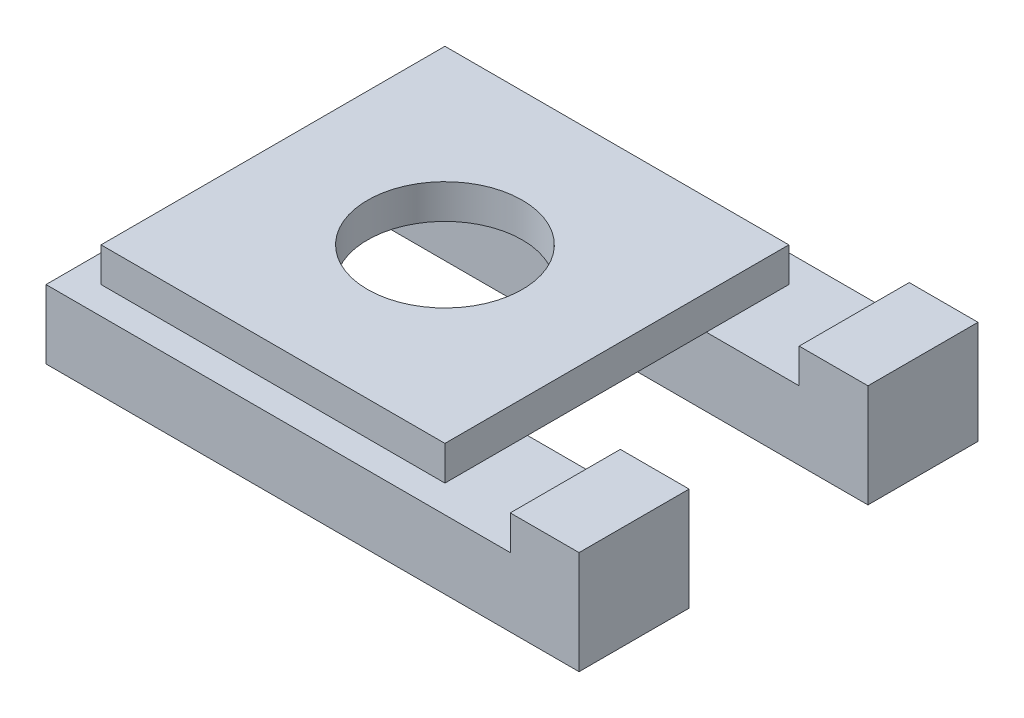
ISO-10303-21;
HEADER;
FILE_DESCRIPTION(('STEP AP214'),'2;1');
FILE_NAME('part.step','',(''),(''),'','','');
FILE_SCHEMA(('AUTOMOTIVE_DESIGN { 1 0 10303 214 1 1 1 1 }'));
ENDSEC;
DATA;
#1=APPLICATION_CONTEXT('core data for automotive mechanical design processes');
#2=APPLICATION_PROTOCOL_DEFINITION('international standard','automotive_design',2000,#1);
#3=PRODUCT_CONTEXT('',#1,'mechanical');
#4=PRODUCT('Part','Part','',(#3));
#5=PRODUCT_RELATED_PRODUCT_CATEGORY('part','',(#4));
#6=PRODUCT_DEFINITION_FORMATION('','',#4);
#7=PRODUCT_DEFINITION_CONTEXT('part definition',#1,'design');
#8=PRODUCT_DEFINITION('design','',#6,#7);
#9=PRODUCT_DEFINITION_SHAPE('','',#8);
#10=(LENGTH_UNIT() NAMED_UNIT(*) SI_UNIT(.MILLI.,.METRE.));
#11=(NAMED_UNIT(*) PLANE_ANGLE_UNIT() SI_UNIT($,.RADIAN.));
#12=(NAMED_UNIT(*) SI_UNIT($,.STERADIAN.) SOLID_ANGLE_UNIT());
#13=UNCERTAINTY_MEASURE_WITH_UNIT(LENGTH_MEASURE(1.E-05),#10,'distance_accuracy_value','');
#14=(GEOMETRIC_REPRESENTATION_CONTEXT(3) GLOBAL_UNCERTAINTY_ASSIGNED_CONTEXT((#13)) GLOBAL_UNIT_ASSIGNED_CONTEXT((#10,
#11,#12)) REPRESENTATION_CONTEXT('',''));
#15=CARTESIAN_POINT('',(0.,0.,0.));
#16=DIRECTION('',(0.,0.,1.));
#17=DIRECTION('',(1.,0.,0.));
#18=AXIS2_PLACEMENT_3D('',#15,#16,#17);
#19=CARTESIAN_POINT('',(0.,0.,0.));
#20=DIRECTION('',(0.,1.,0.));
#21=DIRECTION('',(0.,0.,1.));
#22=AXIS2_PLACEMENT_3D('',#19,#20,#21);
#23=PLANE('',#22);
#24=CARTESIAN_POINT('',(0.,0.,0.));
#25=DIRECTION('',(0.,1.,0.));
#26=DIRECTION('',(0.,0.,1.));
#27=AXIS2_PLACEMENT_3D('',#24,#25,#26);
#28=CIRCLE('',#27,22.5);
#29=CARTESIAN_POINT('',(0.,0.,22.5));
#30=VERTEX_POINT('',#29);
#31=EDGE_CURVE('E311',#30,#30,#28,.T.);
#32=ORIENTED_EDGE('',*,*,#31,.T.);
#33=EDGE_LOOP('',(#32));
#34=FACE_BOUND('',#33,.T.);
#35=DIRECTION('',(-1.,0.,0.));
#36=VECTOR('',#35,1.);
#37=CARTESIAN_POINT('',(77.,0.,-26.));
#38=LINE('',#37,#36);
#39=CARTESIAN_POINT('',(50.,0.,-26.));
#40=VERTEX_POINT('',#39);
#41=CARTESIAN_POINT('',(-50.,0.,-26.));
#42=VERTEX_POINT('',#41);
#43=EDGE_CURVE('E215',#40,#42,#38,.T.);
#44=ORIENTED_EDGE('',*,*,#43,.F.);
#45=DIRECTION('',(0.,0.,-1.));
#46=VECTOR('',#45,1.);
#47=CARTESIAN_POINT('',(50.,0.,50.));
#48=LINE('',#47,#46);
#49=CARTESIAN_POINT('',(50.,0.,26.));
#50=VERTEX_POINT('',#49);
#51=EDGE_CURVE('E130',#50,#40,#48,.T.);
#52=ORIENTED_EDGE('',*,*,#51,.F.);
#53=DIRECTION('',(-1.,0.,0.));
#54=VECTOR('',#53,1.);
#55=CARTESIAN_POINT('',(77.,0.,26.));
#56=LINE('',#55,#54);
#57=CARTESIAN_POINT('',(-50.,0.,26.));
#58=VERTEX_POINT('',#57);
#59=EDGE_CURVE('E191',#50,#58,#56,.T.);
#60=ORIENTED_EDGE('',*,*,#59,.T.);
#61=DIRECTION('',(0.,0.,1.));
#62=VECTOR('',#61,1.);
#63=CARTESIAN_POINT('',(-50.,0.,50.));
#64=LINE('',#63,#62);
#65=EDGE_CURVE('E125',#42,#58,#64,.T.);
#66=ORIENTED_EDGE('',*,*,#65,.F.);
#67=EDGE_LOOP('',(#44,#52,#60,#66));
#68=FACE_BOUND('',#67,.T.);
#69=ADVANCED_FACE('F44',(#34,#68),#23,.F.);
#70=CARTESIAN_POINT('',(0.,10.,0.));
#71=DIRECTION('',(0.,1.,0.));
#72=DIRECTION('',(0.,0.,1.));
#73=AXIS2_PLACEMENT_3D('',#70,#71,#72);
#74=PLANE('',#73);
#75=DIRECTION('',(0.,0.,1.));
#76=VECTOR('',#75,1.);
#77=CARTESIAN_POINT('',(-50.,10.,50.));
#78=LINE('',#77,#76);
#79=CARTESIAN_POINT('',(-50.,10.,-50.));
#80=VERTEX_POINT('',#79);
#81=CARTESIAN_POINT('',(-50.,10.,50.));
#82=VERTEX_POINT('',#81);
#83=EDGE_CURVE('E97',#80,#82,#78,.T.);
#84=ORIENTED_EDGE('',*,*,#83,.T.);
#85=DIRECTION('',(1.,0.,0.));
#86=VECTOR('',#85,1.);
#87=CARTESIAN_POINT('',(50.,10.,50.));
#88=LINE('',#87,#86);
#89=CARTESIAN_POINT('',(50.,10.,50.));
#90=VERTEX_POINT('',#89);
#91=EDGE_CURVE('E93',#82,#90,#88,.T.);
#92=ORIENTED_EDGE('',*,*,#91,.T.);
#93=DIRECTION('',(0.,0.,-1.));
#94=VECTOR('',#93,1.);
#95=CARTESIAN_POINT('',(50.,10.,50.));
#96=LINE('',#95,#94);
#97=CARTESIAN_POINT('',(50.,10.,-50.));
#98=VERTEX_POINT('',#97);
#99=EDGE_CURVE('E96',#90,#98,#96,.T.);
#100=ORIENTED_EDGE('',*,*,#99,.T.);
#101=DIRECTION('',(-1.,0.,0.));
#102=VECTOR('',#101,1.);
#103=CARTESIAN_POINT('',(50.,10.,-50.));
#104=LINE('',#103,#102);
#105=EDGE_CURVE('E62',#98,#80,#104,.T.);
#106=ORIENTED_EDGE('',*,*,#105,.T.);
#107=EDGE_LOOP('',(#84,#92,#100,#106));
#108=FACE_BOUND('',#107,.T.);
#109=CARTESIAN_POINT('',(0.,10.,0.));
#110=DIRECTION('',(0.,1.,0.));
#111=DIRECTION('',(0.,0.,1.));
#112=AXIS2_PLACEMENT_3D('',#109,#110,#111);
#113=CIRCLE('',#112,22.5);
#114=CARTESIAN_POINT('',(0.,10.,22.5));
#115=VERTEX_POINT('',#114);
#116=EDGE_CURVE('E310',#115,#115,#113,.T.);
#117=ORIENTED_EDGE('',*,*,#116,.F.);
#118=EDGE_LOOP('',(#117));
#119=FACE_BOUND('',#118,.T.);
#120=ADVANCED_FACE('F91',(#108,#119),#74,.T.);
#121=CARTESIAN_POINT('',(-50.,10.,50.));
#122=DIRECTION('',(1.,0.,0.));
#123=DIRECTION('',(0.,0.,-1.));
#124=AXIS2_PLACEMENT_3D('',#121,#122,#123);
#125=PLANE('',#124);
#126=CARTESIAN_POINT('',(-50.,0.,-50.));
#127=VERTEX_POINT('',#126);
#128=EDGE_CURVE('E118',#127,#42,#64,.T.);
#129=ORIENTED_EDGE('',*,*,#128,.T.);
#130=ORIENTED_EDGE('',*,*,#65,.T.);
#131=CARTESIAN_POINT('',(-50.,0.,50.));
#132=VERTEX_POINT('',#131);
#133=EDGE_CURVE('E123',#58,#132,#64,.T.);
#134=ORIENTED_EDGE('',*,*,#133,.T.);
#135=DIRECTION('',(0.,-1.,0.));
#136=VECTOR('',#135,1.);
#137=CARTESIAN_POINT('',(-50.,10.,50.));
#138=LINE('',#137,#136);
#139=EDGE_CURVE('E11',#82,#132,#138,.T.);
#140=ORIENTED_EDGE('',*,*,#139,.F.);
#141=ORIENTED_EDGE('',*,*,#83,.F.);
#142=DIRECTION('',(0.,-1.,0.));
#143=VECTOR('',#142,1.);
#144=CARTESIAN_POINT('',(-50.,10.,-50.));
#145=LINE('',#144,#143);
#146=EDGE_CURVE('E113',#80,#127,#145,.T.);
#147=ORIENTED_EDGE('',*,*,#146,.T.);
#148=EDGE_LOOP('',(#129,#130,#134,#140,#141,#147));
#149=FACE_BOUND('',#148,.T.);
#150=ADVANCED_FACE('F50',(#149),#125,.F.);
#151=CARTESIAN_POINT('',(50.,10.,50.));
#152=DIRECTION('',(0.,0.,-1.));
#153=DIRECTION('',(-1.,0.,0.));
#154=AXIS2_PLACEMENT_3D('',#151,#152,#153);
#155=PLANE('',#154);
#156=DIRECTION('',(1.,0.,0.));
#157=VECTOR('',#156,1.);
#158=CARTESIAN_POINT('',(50.,0.,50.));
#159=LINE('',#158,#157);
#160=CARTESIAN_POINT('',(50.,0.,50.));
#161=VERTEX_POINT('',#160);
#162=EDGE_CURVE('E81',#132,#161,#159,.T.);
#163=ORIENTED_EDGE('',*,*,#162,.T.);
#164=DIRECTION('',(0.,-1.,0.));
#165=VECTOR('',#164,1.);
#166=CARTESIAN_POINT('',(50.,10.,50.));
#167=LINE('',#166,#165);
#168=EDGE_CURVE('E54',#90,#161,#167,.T.);
#169=ORIENTED_EDGE('',*,*,#168,.F.);
#170=ORIENTED_EDGE('',*,*,#91,.F.);
#171=ORIENTED_EDGE('',*,*,#139,.T.);
#172=EDGE_LOOP('',(#163,#169,#170,#171));
#173=FACE_BOUND('',#172,.T.);
#174=ADVANCED_FACE('F104',(#173),#155,.F.);
#175=CARTESIAN_POINT('',(50.,10.,50.));
#176=DIRECTION('',(-1.,0.,0.));
#177=DIRECTION('',(0.,0.,1.));
#178=AXIS2_PLACEMENT_3D('',#175,#176,#177);
#179=PLANE('',#178);
#180=EDGE_CURVE('E73',#161,#50,#48,.T.);
#181=ORIENTED_EDGE('',*,*,#180,.T.);
#182=ORIENTED_EDGE('',*,*,#51,.T.);
#183=CARTESIAN_POINT('',(50.,0.,-50.));
#184=VERTEX_POINT('',#183);
#185=EDGE_CURVE('E131',#40,#184,#48,.T.);
#186=ORIENTED_EDGE('',*,*,#185,.T.);
#187=DIRECTION('',(0.,-1.,0.));
#188=VECTOR('',#187,1.);
#189=CARTESIAN_POINT('',(50.,10.,-50.));
#190=LINE('',#189,#188);
#191=EDGE_CURVE('E107',#98,#184,#190,.T.);
#192=ORIENTED_EDGE('',*,*,#191,.F.);
#193=ORIENTED_EDGE('',*,*,#99,.F.);
#194=ORIENTED_EDGE('',*,*,#168,.T.);
#195=EDGE_LOOP('',(#181,#182,#186,#192,#193,#194));
#196=FACE_BOUND('',#195,.T.);
#197=ADVANCED_FACE('F108',(#196),#179,.F.);
#198=CARTESIAN_POINT('',(50.,10.,-50.));
#199=DIRECTION('',(0.,0.,1.));
#200=DIRECTION('',(1.,0.,0.));
#201=AXIS2_PLACEMENT_3D('',#198,#199,#200);
#202=PLANE('',#201);
#203=DIRECTION('',(-1.,0.,0.));
#204=VECTOR('',#203,1.);
#205=CARTESIAN_POINT('',(50.,0.,-50.));
#206=LINE('',#205,#204);
#207=EDGE_CURVE('E128',#184,#127,#206,.T.);
#208=ORIENTED_EDGE('',*,*,#207,.T.);
#209=ORIENTED_EDGE('',*,*,#146,.F.);
#210=ORIENTED_EDGE('',*,*,#105,.F.);
#211=ORIENTED_EDGE('',*,*,#191,.T.);
#212=EDGE_LOOP('',(#208,#209,#210,#211));
#213=FACE_BOUND('',#212,.T.);
#214=ADVANCED_FACE('F143',(#213),#202,.F.);
#215=CARTESIAN_POINT('',(0.,10.,0.));
#216=DIRECTION('',(0.,-1.,0.));
#217=DIRECTION('',(0.,0.,-1.));
#218=AXIS2_PLACEMENT_3D('',#215,#216,#217);
#219=CYLINDRICAL_SURFACE('',#218,22.5);
#220=ORIENTED_EDGE('',*,*,#116,.T.);
#221=EDGE_LOOP('',(#220));
#222=FACE_BOUND('',#221,.T.);
#223=ORIENTED_EDGE('',*,*,#31,.F.);
#224=EDGE_LOOP('',(#223));
#225=FACE_BOUND('',#224,.T.);
#226=ADVANCED_FACE('F365',(#222,#225),#219,.F.);
#227=CARTESIAN_POINT('',(77.,0.,26.));
#228=DIRECTION('',(0.,1.,0.));
#229=DIRECTION('',(-1.,0.,0.));
#230=AXIS2_PLACEMENT_3D('',#227,#228,#229);
#231=PLANE('',#230);
#232=ORIENTED_EDGE('',*,*,#133,.F.);
#233=CARTESIAN_POINT('',(-58.,0.,26.));
#234=VERTEX_POINT('',#233);
#235=EDGE_CURVE('E196',#58,#234,#56,.T.);
#236=ORIENTED_EDGE('',*,*,#235,.T.);
#237=DIRECTION('',(0.,0.,1.));
#238=VECTOR('',#237,1.);
#239=CARTESIAN_POINT('',(-58.,0.,26.));
#240=LINE('',#239,#238);
#241=CARTESIAN_POINT('',(-58.,0.,58.));
#242=VERTEX_POINT('',#241);
#243=EDGE_CURVE('E275',#234,#242,#240,.T.);
#244=ORIENTED_EDGE('',*,*,#243,.T.);
#245=DIRECTION('',(-1.,0.,0.));
#246=VECTOR('',#245,1.);
#247=CARTESIAN_POINT('',(77.,0.,58.));
#248=LINE('',#247,#246);
#249=CARTESIAN_POINT('',(77.,0.,58.));
#250=VERTEX_POINT('',#249);
#251=EDGE_CURVE('E214',#250,#242,#248,.T.);
#252=ORIENTED_EDGE('',*,*,#251,.F.);
#253=DIRECTION('',(0.,0.,1.));
#254=VECTOR('',#253,1.);
#255=CARTESIAN_POINT('',(77.,0.,26.));
#256=LINE('',#255,#254);
#257=CARTESIAN_POINT('',(77.,0.,26.));
#258=VERTEX_POINT('',#257);
#259=EDGE_CURVE('E206',#258,#250,#256,.T.);
#260=ORIENTED_EDGE('',*,*,#259,.F.);
#261=EDGE_CURVE('E192',#258,#50,#56,.T.);
#262=ORIENTED_EDGE('',*,*,#261,.T.);
#263=ORIENTED_EDGE('',*,*,#180,.F.);
#264=ORIENTED_EDGE('',*,*,#162,.F.);
#265=EDGE_LOOP('',(#232,#236,#244,#252,#260,#262,#263,#264));
#266=FACE_BOUND('',#265,.T.);
#267=ADVANCED_FACE('F204',(#266),#231,.T.);
#268=CARTESIAN_POINT('',(77.,10.,26.));
#269=DIRECTION('',(-1.,0.,0.));
#270=DIRECTION('',(0.,0.,1.));
#271=AXIS2_PLACEMENT_3D('',#268,#269,#270);
#272=PLANE('',#271);
#273=DIRECTION('',(0.,-1.,0.));
#274=VECTOR('',#273,1.);
#275=CARTESIAN_POINT('',(77.,10.,58.));
#276=LINE('',#275,#274);
#277=CARTESIAN_POINT('',(77.,10.,58.));
#278=VERTEX_POINT('',#277);
#279=EDGE_CURVE('E288',#278,#250,#276,.T.);
#280=ORIENTED_EDGE('',*,*,#279,.F.);
#281=DIRECTION('',(0.,0.,1.));
#282=VECTOR('',#281,1.);
#283=CARTESIAN_POINT('',(77.,10.,26.));
#284=LINE('',#283,#282);
#285=CARTESIAN_POINT('',(77.,10.,26.));
#286=VERTEX_POINT('',#285);
#287=EDGE_CURVE('E293',#286,#278,#284,.T.);
#288=ORIENTED_EDGE('',*,*,#287,.F.);
#289=DIRECTION('',(0.,-1.,0.));
#290=VECTOR('',#289,1.);
#291=CARTESIAN_POINT('',(77.,10.,26.));
#292=LINE('',#291,#290);
#293=EDGE_CURVE('E269',#286,#258,#292,.T.);
#294=ORIENTED_EDGE('',*,*,#293,.T.);
#295=ORIENTED_EDGE('',*,*,#259,.T.);
#296=EDGE_LOOP('',(#280,#288,#294,#295));
#297=FACE_BOUND('',#296,.T.);
#298=ADVANCED_FACE('F338',(#297),#272,.T.);
#299=CARTESIAN_POINT('',(97.,10.,26.));
#300=DIRECTION('',(0.,1.,0.));
#301=DIRECTION('',(0.,0.,1.));
#302=AXIS2_PLACEMENT_3D('',#299,#300,#301);
#303=PLANE('',#302);
#304=DIRECTION('',(-1.,0.,0.));
#305=VECTOR('',#304,1.);
#306=CARTESIAN_POINT('',(97.,10.,58.));
#307=LINE('',#306,#305);
#308=CARTESIAN_POINT('',(97.,10.,58.));
#309=VERTEX_POINT('',#308);
#310=EDGE_CURVE('E284',#309,#278,#307,.T.);
#311=ORIENTED_EDGE('',*,*,#310,.F.);
#312=DIRECTION('',(0.,0.,1.));
#313=VECTOR('',#312,1.);
#314=CARTESIAN_POINT('',(97.,10.,26.));
#315=LINE('',#314,#313);
#316=CARTESIAN_POINT('',(97.,10.,26.));
#317=VERTEX_POINT('',#316);
#318=EDGE_CURVE('E297',#317,#309,#315,.T.);
#319=ORIENTED_EDGE('',*,*,#318,.F.);
#320=DIRECTION('',(-1.,0.,0.));
#321=VECTOR('',#320,1.);
#322=CARTESIAN_POINT('',(97.,10.,26.));
#323=LINE('',#322,#321);
#324=EDGE_CURVE('E266',#317,#286,#323,.T.);
#325=ORIENTED_EDGE('',*,*,#324,.T.);
#326=ORIENTED_EDGE('',*,*,#287,.T.);
#327=EDGE_LOOP('',(#311,#319,#325,#326));
#328=FACE_BOUND('',#327,.T.);
#329=ADVANCED_FACE('F345',(#328),#303,.T.);
#330=CARTESIAN_POINT('',(97.,-20.,26.));
#331=DIRECTION('',(1.,0.,0.));
#332=DIRECTION('',(0.,0.,-1.));
#333=AXIS2_PLACEMENT_3D('',#330,#331,#332);
#334=PLANE('',#333);
#335=DIRECTION('',(0.,1.,0.));
#336=VECTOR('',#335,1.);
#337=CARTESIAN_POINT('',(97.,-20.,58.));
#338=LINE('',#337,#336);
#339=CARTESIAN_POINT('',(97.,-20.,58.));
#340=VERTEX_POINT('',#339);
#341=EDGE_CURVE('E281',#340,#309,#338,.T.);
#342=ORIENTED_EDGE('',*,*,#341,.F.);
#343=DIRECTION('',(0.,0.,1.));
#344=VECTOR('',#343,1.);
#345=CARTESIAN_POINT('',(97.,-20.,26.));
#346=LINE('',#345,#344);
#347=CARTESIAN_POINT('',(97.,-20.,26.));
#348=VERTEX_POINT('',#347);
#349=EDGE_CURVE('E304',#348,#340,#346,.T.);
#350=ORIENTED_EDGE('',*,*,#349,.F.);
#351=DIRECTION('',(0.,1.,0.));
#352=VECTOR('',#351,1.);
#353=CARTESIAN_POINT('',(97.,-20.,26.));
#354=LINE('',#353,#352);
#355=EDGE_CURVE('E265',#348,#317,#354,.T.);
#356=ORIENTED_EDGE('',*,*,#355,.T.);
#357=ORIENTED_EDGE('',*,*,#318,.T.);
#358=EDGE_LOOP('',(#342,#350,#356,#357));
#359=FACE_BOUND('',#358,.T.);
#360=ADVANCED_FACE('F341',(#359),#334,.T.);
#361=CARTESIAN_POINT('',(-58.,-20.,26.));
#362=DIRECTION('',(0.,-1.,0.));
#363=DIRECTION('',(0.,0.,-1.));
#364=AXIS2_PLACEMENT_3D('',#361,#362,#363);
#365=PLANE('',#364);
#366=DIRECTION('',(1.,0.,0.));
#367=VECTOR('',#366,1.);
#368=CARTESIAN_POINT('',(-58.,-20.,58.));
#369=LINE('',#368,#367);
#370=CARTESIAN_POINT('',(-58.,-20.,58.));
#371=VERTEX_POINT('',#370);
#372=EDGE_CURVE('E280',#371,#340,#369,.T.);
#373=ORIENTED_EDGE('',*,*,#372,.F.);
#374=DIRECTION('',(0.,0.,1.));
#375=VECTOR('',#374,1.);
#376=CARTESIAN_POINT('',(-58.,-20.,26.));
#377=LINE('',#376,#375);
#378=CARTESIAN_POINT('',(-58.,-20.,26.));
#379=VERTEX_POINT('',#378);
#380=EDGE_CURVE('E303',#379,#371,#377,.T.);
#381=ORIENTED_EDGE('',*,*,#380,.F.);
#382=DIRECTION('',(1.,0.,0.));
#383=VECTOR('',#382,1.);
#384=CARTESIAN_POINT('',(-58.,-20.,26.));
#385=LINE('',#384,#383);
#386=EDGE_CURVE('E256',#379,#348,#385,.T.);
#387=ORIENTED_EDGE('',*,*,#386,.T.);
#388=ORIENTED_EDGE('',*,*,#349,.T.);
#389=EDGE_LOOP('',(#373,#381,#387,#388));
#390=FACE_BOUND('',#389,.T.);
#391=ADVANCED_FACE('F335',(#390),#365,.T.);
#392=CARTESIAN_POINT('',(-58.,0.,26.));
#393=DIRECTION('',(-1.,0.,0.));
#394=DIRECTION('',(0.,0.,1.));
#395=AXIS2_PLACEMENT_3D('',#392,#393,#394);
#396=PLANE('',#395);
#397=DIRECTION('',(0.,-1.,0.));
#398=VECTOR('',#397,1.);
#399=CARTESIAN_POINT('',(-58.,0.,58.));
#400=LINE('',#399,#398);
#401=EDGE_CURVE('E219',#242,#371,#400,.T.);
#402=ORIENTED_EDGE('',*,*,#401,.F.);
#403=ORIENTED_EDGE('',*,*,#243,.F.);
#404=DIRECTION('',(0.,-1.,0.));
#405=VECTOR('',#404,1.);
#406=CARTESIAN_POINT('',(-58.,0.,26.));
#407=LINE('',#406,#405);
#408=EDGE_CURVE('E208',#234,#379,#407,.T.);
#409=ORIENTED_EDGE('',*,*,#408,.T.);
#410=ORIENTED_EDGE('',*,*,#380,.T.);
#411=EDGE_LOOP('',(#402,#403,#409,#410));
#412=FACE_BOUND('',#411,.T.);
#413=ADVANCED_FACE('F326',(#412),#396,.T.);
#414=CARTESIAN_POINT('',(0.,0.,26.));
#415=DIRECTION('',(0.,0.,1.));
#416=DIRECTION('',(1.,0.,0.));
#417=AXIS2_PLACEMENT_3D('',#414,#415,#416);
#418=PLANE('',#417);
#419=ORIENTED_EDGE('',*,*,#261,.F.);
#420=ORIENTED_EDGE('',*,*,#293,.F.);
#421=ORIENTED_EDGE('',*,*,#324,.F.);
#422=ORIENTED_EDGE('',*,*,#355,.F.);
#423=ORIENTED_EDGE('',*,*,#386,.F.);
#424=ORIENTED_EDGE('',*,*,#408,.F.);
#425=ORIENTED_EDGE('',*,*,#235,.F.);
#426=ORIENTED_EDGE('',*,*,#59,.F.);
#427=EDGE_LOOP('',(#419,#420,#421,#422,#423,#424,#425,#426));
#428=FACE_BOUND('',#427,.T.);
#429=ADVANCED_FACE('F195',(#428),#418,.F.);
#430=CARTESIAN_POINT('',(0.,0.,58.));
#431=DIRECTION('',(0.,0.,1.));
#432=DIRECTION('',(1.,0.,0.));
#433=AXIS2_PLACEMENT_3D('',#430,#431,#432);
#434=PLANE('',#433);
#435=ORIENTED_EDGE('',*,*,#251,.T.);
#436=ORIENTED_EDGE('',*,*,#401,.T.);
#437=ORIENTED_EDGE('',*,*,#372,.T.);
#438=ORIENTED_EDGE('',*,*,#341,.T.);
#439=ORIENTED_EDGE('',*,*,#310,.T.);
#440=ORIENTED_EDGE('',*,*,#279,.T.);
#441=EDGE_LOOP('',(#435,#436,#437,#438,#439,#440));
#442=FACE_BOUND('',#441,.T.);
#443=ADVANCED_FACE('F333',(#442),#434,.T.);
#444=CARTESIAN_POINT('',(77.,0.,-26.));
#445=DIRECTION('',(0.,-1.,0.));
#446=DIRECTION('',(1.,0.,0.));
#447=AXIS2_PLACEMENT_3D('',#444,#445,#446);
#448=PLANE('',#447);
#449=ORIENTED_EDGE('',*,*,#185,.F.);
#450=CARTESIAN_POINT('',(77.,0.,-26.));
#451=VERTEX_POINT('',#450);
#452=EDGE_CURVE('E583',#451,#40,#38,.T.);
#453=ORIENTED_EDGE('',*,*,#452,.F.);
#454=DIRECTION('',(0.,0.,-1.));
#455=VECTOR('',#454,1.);
#456=CARTESIAN_POINT('',(77.,0.,-26.));
#457=LINE('',#456,#455);
#458=CARTESIAN_POINT('',(77.,0.,-58.));
#459=VERTEX_POINT('',#458);
#460=EDGE_CURVE('E247',#451,#459,#457,.T.);
#461=ORIENTED_EDGE('',*,*,#460,.T.);
#462=DIRECTION('',(-1.,0.,0.));
#463=VECTOR('',#462,1.);
#464=CARTESIAN_POINT('',(77.,0.,-58.));
#465=LINE('',#464,#463);
#466=CARTESIAN_POINT('',(-58.,0.,-58.));
#467=VERTEX_POINT('',#466);
#468=EDGE_CURVE('E547',#459,#467,#465,.T.);
#469=ORIENTED_EDGE('',*,*,#468,.T.);
#470=DIRECTION('',(0.,0.,-1.));
#471=VECTOR('',#470,1.);
#472=CARTESIAN_POINT('',(-58.,0.,-26.));
#473=LINE('',#472,#471);
#474=CARTESIAN_POINT('',(-58.,0.,-26.));
#475=VERTEX_POINT('',#474);
#476=EDGE_CURVE('E216',#475,#467,#473,.T.);
#477=ORIENTED_EDGE('',*,*,#476,.F.);
#478=EDGE_CURVE('E574',#42,#475,#38,.T.);
#479=ORIENTED_EDGE('',*,*,#478,.F.);
#480=ORIENTED_EDGE('',*,*,#128,.F.);
#481=ORIENTED_EDGE('',*,*,#207,.F.);
#482=EDGE_LOOP('',(#449,#453,#461,#469,#477,#479,#480,#481));
#483=FACE_BOUND('',#482,.T.);
#484=ADVANCED_FACE('F386',(#483),#448,.F.);
#485=CARTESIAN_POINT('',(-58.,0.,-26.));
#486=DIRECTION('',(1.,0.,0.));
#487=DIRECTION('',(0.,0.,-1.));
#488=AXIS2_PLACEMENT_3D('',#485,#486,#487);
#489=PLANE('',#488);
#490=DIRECTION('',(0.,-1.,0.));
#491=VECTOR('',#490,1.);
#492=CARTESIAN_POINT('',(-58.,0.,-58.));
#493=LINE('',#492,#491);
#494=CARTESIAN_POINT('',(-58.,-20.,-58.));
#495=VERTEX_POINT('',#494);
#496=EDGE_CURVE('E237',#467,#495,#493,.T.);
#497=ORIENTED_EDGE('',*,*,#496,.T.);
#498=DIRECTION('',(0.,0.,-1.));
#499=VECTOR('',#498,1.);
#500=CARTESIAN_POINT('',(-58.,-20.,-26.));
#501=LINE('',#500,#499);
#502=CARTESIAN_POINT('',(-58.,-20.,-26.));
#503=VERTEX_POINT('',#502);
#504=EDGE_CURVE('E224',#503,#495,#501,.T.);
#505=ORIENTED_EDGE('',*,*,#504,.F.);
#506=DIRECTION('',(0.,-1.,0.));
#507=VECTOR('',#506,1.);
#508=CARTESIAN_POINT('',(-58.,0.,-26.));
#509=LINE('',#508,#507);
#510=EDGE_CURVE('E251',#475,#503,#509,.T.);
#511=ORIENTED_EDGE('',*,*,#510,.F.);
#512=ORIENTED_EDGE('',*,*,#476,.T.);
#513=EDGE_LOOP('',(#497,#505,#511,#512));
#514=FACE_BOUND('',#513,.T.);
#515=ADVANCED_FACE('F392',(#514),#489,.F.);
#516=CARTESIAN_POINT('',(-58.,-20.,-26.));
#517=DIRECTION('',(0.,1.,0.));
#518=DIRECTION('',(0.,0.,1.));
#519=AXIS2_PLACEMENT_3D('',#516,#517,#518);
#520=PLANE('',#519);
#521=DIRECTION('',(1.,0.,0.));
#522=VECTOR('',#521,1.);
#523=CARTESIAN_POINT('',(-58.,-20.,-58.));
#524=LINE('',#523,#522);
#525=CARTESIAN_POINT('',(97.,-20.,-58.));
#526=VERTEX_POINT('',#525);
#527=EDGE_CURVE('E569',#495,#526,#524,.T.);
#528=ORIENTED_EDGE('',*,*,#527,.T.);
#529=DIRECTION('',(0.,0.,-1.));
#530=VECTOR('',#529,1.);
#531=CARTESIAN_POINT('',(97.,-20.,-26.));
#532=LINE('',#531,#530);
#533=CARTESIAN_POINT('',(97.,-20.,-26.));
#534=VERTEX_POINT('',#533);
#535=EDGE_CURVE('E235',#534,#526,#532,.T.);
#536=ORIENTED_EDGE('',*,*,#535,.F.);
#537=DIRECTION('',(1.,0.,0.));
#538=VECTOR('',#537,1.);
#539=CARTESIAN_POINT('',(-58.,-20.,-26.));
#540=LINE('',#539,#538);
#541=EDGE_CURVE('E602',#503,#534,#540,.T.);
#542=ORIENTED_EDGE('',*,*,#541,.F.);
#543=ORIENTED_EDGE('',*,*,#504,.T.);
#544=EDGE_LOOP('',(#528,#536,#542,#543));
#545=FACE_BOUND('',#544,.T.);
#546=ADVANCED_FACE('F405',(#545),#520,.F.);
#547=CARTESIAN_POINT('',(97.,-20.,-26.));
#548=DIRECTION('',(-1.,0.,0.));
#549=DIRECTION('',(0.,0.,1.));
#550=AXIS2_PLACEMENT_3D('',#547,#548,#549);
#551=PLANE('',#550);
#552=DIRECTION('',(0.,1.,0.));
#553=VECTOR('',#552,1.);
#554=CARTESIAN_POINT('',(97.,-20.,-58.));
#555=LINE('',#554,#553);
#556=CARTESIAN_POINT('',(97.,10.,-58.));
#557=VERTEX_POINT('',#556);
#558=EDGE_CURVE('E567',#526,#557,#555,.T.);
#559=ORIENTED_EDGE('',*,*,#558,.T.);
#560=DIRECTION('',(0.,0.,-1.));
#561=VECTOR('',#560,1.);
#562=CARTESIAN_POINT('',(97.,10.,-26.));
#563=LINE('',#562,#561);
#564=CARTESIAN_POINT('',(97.,10.,-26.));
#565=VERTEX_POINT('',#564);
#566=EDGE_CURVE('E245',#565,#557,#563,.T.);
#567=ORIENTED_EDGE('',*,*,#566,.F.);
#568=DIRECTION('',(0.,1.,0.));
#569=VECTOR('',#568,1.);
#570=CARTESIAN_POINT('',(97.,-20.,-26.));
#571=LINE('',#570,#569);
#572=EDGE_CURVE('E598',#534,#565,#571,.T.);
#573=ORIENTED_EDGE('',*,*,#572,.F.);
#574=ORIENTED_EDGE('',*,*,#535,.T.);
#575=EDGE_LOOP('',(#559,#567,#573,#574));
#576=FACE_BOUND('',#575,.T.);
#577=ADVANCED_FACE('F409',(#576),#551,.F.);
#578=CARTESIAN_POINT('',(97.,10.,-26.));
#579=DIRECTION('',(0.,-1.,0.));
#580=DIRECTION('',(0.,0.,-1.));
#581=AXIS2_PLACEMENT_3D('',#578,#579,#580);
#582=PLANE('',#581);
#583=DIRECTION('',(-1.,0.,0.));
#584=VECTOR('',#583,1.);
#585=CARTESIAN_POINT('',(97.,10.,-58.));
#586=LINE('',#585,#584);
#587=CARTESIAN_POINT('',(77.,10.,-58.));
#588=VERTEX_POINT('',#587);
#589=EDGE_CURVE('E557',#557,#588,#586,.T.);
#590=ORIENTED_EDGE('',*,*,#589,.T.);
#591=DIRECTION('',(0.,0.,-1.));
#592=VECTOR('',#591,1.);
#593=CARTESIAN_POINT('',(77.,10.,-26.));
#594=LINE('',#593,#592);
#595=CARTESIAN_POINT('',(77.,10.,-26.));
#596=VERTEX_POINT('',#595);
#597=EDGE_CURVE('E249',#596,#588,#594,.T.);
#598=ORIENTED_EDGE('',*,*,#597,.F.);
#599=DIRECTION('',(-1.,0.,0.));
#600=VECTOR('',#599,1.);
#601=CARTESIAN_POINT('',(97.,10.,-26.));
#602=LINE('',#601,#600);
#603=EDGE_CURVE('E595',#565,#596,#602,.T.);
#604=ORIENTED_EDGE('',*,*,#603,.F.);
#605=ORIENTED_EDGE('',*,*,#566,.T.);
#606=EDGE_LOOP('',(#590,#598,#604,#605));
#607=FACE_BOUND('',#606,.T.);
#608=ADVANCED_FACE('F420',(#607),#582,.F.);
#609=CARTESIAN_POINT('',(77.,10.,-26.));
#610=DIRECTION('',(1.,0.,0.));
#611=DIRECTION('',(0.,0.,-1.));
#612=AXIS2_PLACEMENT_3D('',#609,#610,#611);
#613=PLANE('',#612);
#614=DIRECTION('',(0.,-1.,0.));
#615=VECTOR('',#614,1.);
#616=CARTESIAN_POINT('',(77.,10.,-58.));
#617=LINE('',#616,#615);
#618=EDGE_CURVE('E555',#588,#459,#617,.T.);
#619=ORIENTED_EDGE('',*,*,#618,.T.);
#620=ORIENTED_EDGE('',*,*,#460,.F.);
#621=DIRECTION('',(0.,-1.,0.));
#622=VECTOR('',#621,1.);
#623=CARTESIAN_POINT('',(77.,10.,-26.));
#624=LINE('',#623,#622);
#625=EDGE_CURVE('E586',#596,#451,#624,.T.);
#626=ORIENTED_EDGE('',*,*,#625,.F.);
#627=ORIENTED_EDGE('',*,*,#597,.T.);
#628=EDGE_LOOP('',(#619,#620,#626,#627));
#629=FACE_BOUND('',#628,.T.);
#630=ADVANCED_FACE('F428',(#629),#613,.F.);
#631=CARTESIAN_POINT('',(0.,0.,-26.));
#632=DIRECTION('',(0.,0.,-1.));
#633=DIRECTION('',(1.,0.,0.));
#634=AXIS2_PLACEMENT_3D('',#631,#632,#633);
#635=PLANE('',#634);
#636=ORIENTED_EDGE('',*,*,#452,.T.);
#637=ORIENTED_EDGE('',*,*,#43,.T.);
#638=ORIENTED_EDGE('',*,*,#478,.T.);
#639=ORIENTED_EDGE('',*,*,#510,.T.);
#640=ORIENTED_EDGE('',*,*,#541,.T.);
#641=ORIENTED_EDGE('',*,*,#572,.T.);
#642=ORIENTED_EDGE('',*,*,#603,.T.);
#643=ORIENTED_EDGE('',*,*,#625,.T.);
#644=EDGE_LOOP('',(#636,#637,#638,#639,#640,#641,#642,#643));
#645=FACE_BOUND('',#644,.T.);
#646=ADVANCED_FACE('F440',(#645),#635,.F.);
#647=CARTESIAN_POINT('',(0.,0.,-58.));
#648=DIRECTION('',(0.,0.,-1.));
#649=DIRECTION('',(1.,0.,0.));
#650=AXIS2_PLACEMENT_3D('',#647,#648,#649);
#651=PLANE('',#650);
#652=ORIENTED_EDGE('',*,*,#468,.F.);
#653=ORIENTED_EDGE('',*,*,#618,.F.);
#654=ORIENTED_EDGE('',*,*,#589,.F.);
#655=ORIENTED_EDGE('',*,*,#558,.F.);
#656=ORIENTED_EDGE('',*,*,#527,.F.);
#657=ORIENTED_EDGE('',*,*,#496,.F.);
#658=EDGE_LOOP('',(#652,#653,#654,#655,#656,#657));
#659=FACE_BOUND('',#658,.T.);
#660=ADVANCED_FACE('F446',(#659),#651,.T.);
#661=CLOSED_SHELL('',(#69,#120,#150,#174,#197,#214,#226,#267,#298,#329,#360,#391,#413,#429,#443,
#484,#515,#546,#577,#608,#630,#646,#660));
#662=MANIFOLD_SOLID_BREP('B2',#661);
#663=ADVANCED_BREP_SHAPE_REPRESENTATION('',(#18,#662),#14);
#664=SHAPE_DEFINITION_REPRESENTATION(#9,#663);
ENDSEC;
END-ISO-10303-21;
